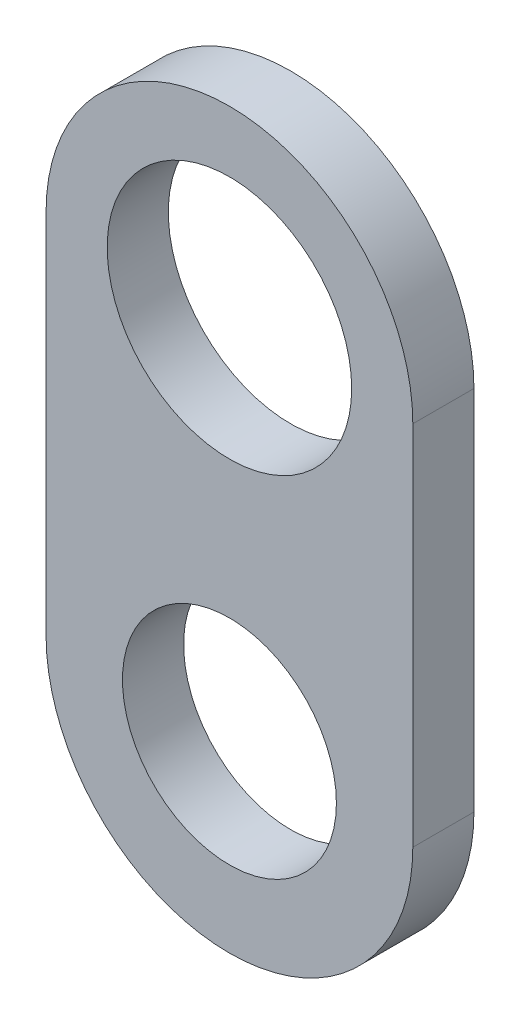
ISO-10303-21;
HEADER;
FILE_DESCRIPTION(('STEP AP214'),'2;1');
FILE_NAME('part.step','',(''),(''),'','','');
FILE_SCHEMA(('AUTOMOTIVE_DESIGN { 1 0 10303 214 1 1 1 1 }'));
ENDSEC;
DATA;
#1=APPLICATION_CONTEXT('core data for automotive mechanical design processes');
#2=APPLICATION_PROTOCOL_DEFINITION('international standard','automotive_design',2000,#1);
#3=PRODUCT_CONTEXT('',#1,'mechanical');
#4=PRODUCT('Part','Part','',(#3));
#5=PRODUCT_RELATED_PRODUCT_CATEGORY('part','',(#4));
#6=PRODUCT_DEFINITION_FORMATION('','',#4);
#7=PRODUCT_DEFINITION_CONTEXT('part definition',#1,'design');
#8=PRODUCT_DEFINITION('design','',#6,#7);
#9=PRODUCT_DEFINITION_SHAPE('','',#8);
#10=(LENGTH_UNIT() NAMED_UNIT(*) SI_UNIT(.MILLI.,.METRE.));
#11=(NAMED_UNIT(*) PLANE_ANGLE_UNIT() SI_UNIT($,.RADIAN.));
#12=(NAMED_UNIT(*) SI_UNIT($,.STERADIAN.) SOLID_ANGLE_UNIT());
#13=UNCERTAINTY_MEASURE_WITH_UNIT(LENGTH_MEASURE(1.E-05),#10,'distance_accuracy_value','');
#14=(GEOMETRIC_REPRESENTATION_CONTEXT(3) GLOBAL_UNCERTAINTY_ASSIGNED_CONTEXT((#13)) GLOBAL_UNIT_ASSIGNED_CONTEXT((#10,
#11,#12)) REPRESENTATION_CONTEXT('',''));
#15=CARTESIAN_POINT('',(0.,0.,0.));
#16=DIRECTION('',(0.,0.,1.));
#17=DIRECTION('',(1.,0.,0.));
#18=AXIS2_PLACEMENT_3D('',#15,#16,#17);
#19=CARTESIAN_POINT('',(0.,0.,250.));
#20=DIRECTION('',(0.,0.,-1.));
#21=DIRECTION('',(-1.,0.,0.));
#22=AXIS2_PLACEMENT_3D('',#19,#20,#21);
#23=CYLINDRICAL_SURFACE('',#22,750.);
#24=CARTESIAN_POINT('',(0.,0.,0.));
#25=DIRECTION('',(0.,0.,1.));
#26=DIRECTION('',(1.,0.,0.));
#27=AXIS2_PLACEMENT_3D('',#24,#25,#26);
#28=CIRCLE('',#27,750.);
#29=CARTESIAN_POINT('',(750.,0.,0.));
#30=VERTEX_POINT('',#29);
#31=CARTESIAN_POINT('',(-750.,0.,0.));
#32=VERTEX_POINT('',#31);
#33=EDGE_CURVE('E111',#30,#32,#28,.T.);
#34=ORIENTED_EDGE('',*,*,#33,.T.);
#35=DIRECTION('',(0.,0.,-1.));
#36=VECTOR('',#35,1.);
#37=CARTESIAN_POINT('',(-750.,0.,250.));
#38=LINE('',#37,#36);
#39=CARTESIAN_POINT('',(-750.,0.,250.));
#40=VERTEX_POINT('',#39);
#41=EDGE_CURVE('E11',#40,#32,#38,.T.);
#42=ORIENTED_EDGE('',*,*,#41,.F.);
#43=CARTESIAN_POINT('',(0.,0.,250.));
#44=DIRECTION('',(0.,0.,1.));
#45=DIRECTION('',(1.,0.,0.));
#46=AXIS2_PLACEMENT_3D('',#43,#44,#45);
#47=CIRCLE('',#46,750.);
#48=CARTESIAN_POINT('',(750.,0.,250.));
#49=VERTEX_POINT('',#48);
#50=EDGE_CURVE('E100',#49,#40,#47,.T.);
#51=ORIENTED_EDGE('',*,*,#50,.F.);
#52=DIRECTION('',(0.,0.,-1.));
#53=VECTOR('',#52,1.);
#54=CARTESIAN_POINT('',(750.,0.,250.));
#55=LINE('',#54,#53);
#56=EDGE_CURVE('E109',#49,#30,#55,.T.);
#57=ORIENTED_EDGE('',*,*,#56,.T.);
#58=EDGE_LOOP('',(#34,#42,#51,#57));
#59=FACE_BOUND('',#58,.T.);
#60=ADVANCED_FACE('F44',(#59),#23,.T.);
#61=CARTESIAN_POINT('',(-750.,0.,250.));
#62=DIRECTION('',(1.,0.,0.));
#63=DIRECTION('',(0.,1.,0.));
#64=AXIS2_PLACEMENT_3D('',#61,#62,#63);
#65=PLANE('',#64);
#66=DIRECTION('',(0.,-1.,0.));
#67=VECTOR('',#66,1.);
#68=CARTESIAN_POINT('',(-750.,0.,0.));
#69=LINE('',#68,#67);
#70=CARTESIAN_POINT('',(-750.,-1500.,0.));
#71=VERTEX_POINT('',#70);
#72=EDGE_CURVE('E105',#32,#71,#69,.T.);
#73=ORIENTED_EDGE('',*,*,#72,.T.);
#74=DIRECTION('',(0.,0.,-1.));
#75=VECTOR('',#74,1.);
#76=CARTESIAN_POINT('',(-750.,-1500.,250.));
#77=LINE('',#76,#75);
#78=CARTESIAN_POINT('',(-750.,-1500.,250.));
#79=VERTEX_POINT('',#78);
#80=EDGE_CURVE('E53',#79,#71,#77,.T.);
#81=ORIENTED_EDGE('',*,*,#80,.F.);
#82=DIRECTION('',(0.,-1.,0.));
#83=VECTOR('',#82,1.);
#84=CARTESIAN_POINT('',(-750.,0.,250.));
#85=LINE('',#84,#83);
#86=EDGE_CURVE('E95',#40,#79,#85,.T.);
#87=ORIENTED_EDGE('',*,*,#86,.F.);
#88=ORIENTED_EDGE('',*,*,#41,.T.);
#89=EDGE_LOOP('',(#73,#81,#87,#88));
#90=FACE_BOUND('',#89,.T.);
#91=ADVANCED_FACE('F102',(#90),#65,.F.);
#92=CARTESIAN_POINT('',(0.,-1500.,250.));
#93=DIRECTION('',(0.,0.,-1.));
#94=DIRECTION('',(-1.,0.,0.));
#95=AXIS2_PLACEMENT_3D('',#92,#93,#94);
#96=CYLINDRICAL_SURFACE('',#95,750.);
#97=CARTESIAN_POINT('',(0.,-1500.,0.));
#98=DIRECTION('',(0.,0.,1.));
#99=DIRECTION('',(1.,0.,0.));
#100=AXIS2_PLACEMENT_3D('',#97,#98,#99);
#101=CIRCLE('',#100,750.);
#102=CARTESIAN_POINT('',(750.,-1500.,0.));
#103=VERTEX_POINT('',#102);
#104=EDGE_CURVE('E80',#71,#103,#101,.T.);
#105=ORIENTED_EDGE('',*,*,#104,.T.);
#106=DIRECTION('',(0.,0.,-1.));
#107=VECTOR('',#106,1.);
#108=CARTESIAN_POINT('',(750.,-1500.,250.));
#109=LINE('',#108,#107);
#110=CARTESIAN_POINT('',(750.,-1500.,250.));
#111=VERTEX_POINT('',#110);
#112=EDGE_CURVE('E101',#111,#103,#109,.T.);
#113=ORIENTED_EDGE('',*,*,#112,.F.);
#114=CARTESIAN_POINT('',(0.,-1500.,250.));
#115=DIRECTION('',(0.,0.,1.));
#116=DIRECTION('',(1.,0.,0.));
#117=AXIS2_PLACEMENT_3D('',#114,#115,#116);
#118=CIRCLE('',#117,750.);
#119=EDGE_CURVE('E94',#79,#111,#118,.T.);
#120=ORIENTED_EDGE('',*,*,#119,.F.);
#121=ORIENTED_EDGE('',*,*,#80,.T.);
#122=EDGE_LOOP('',(#105,#113,#120,#121));
#123=FACE_BOUND('',#122,.T.);
#124=ADVANCED_FACE('F103',(#123),#96,.T.);
#125=CARTESIAN_POINT('',(750.,0.,250.));
#126=DIRECTION('',(-1.,0.,0.));
#127=DIRECTION('',(0.,0.,1.));
#128=AXIS2_PLACEMENT_3D('',#125,#126,#127);
#129=PLANE('',#128);
#130=DIRECTION('',(0.,1.,0.));
#131=VECTOR('',#130,1.);
#132=CARTESIAN_POINT('',(750.,0.,0.));
#133=LINE('',#132,#131);
#134=EDGE_CURVE('E82',#103,#30,#133,.T.);
#135=ORIENTED_EDGE('',*,*,#134,.T.);
#136=ORIENTED_EDGE('',*,*,#56,.F.);
#137=DIRECTION('',(0.,1.,0.));
#138=VECTOR('',#137,1.);
#139=CARTESIAN_POINT('',(750.,0.,250.));
#140=LINE('',#139,#138);
#141=EDGE_CURVE('E65',#111,#49,#140,.T.);
#142=ORIENTED_EDGE('',*,*,#141,.F.);
#143=ORIENTED_EDGE('',*,*,#112,.T.);
#144=EDGE_LOOP('',(#135,#136,#142,#143));
#145=FACE_BOUND('',#144,.T.);
#146=ADVANCED_FACE('F130',(#145),#129,.F.);
#147=CARTESIAN_POINT('',(0.,0.,250.));
#148=DIRECTION('',(0.,0.,1.));
#149=DIRECTION('',(1.,0.,0.));
#150=AXIS2_PLACEMENT_3D('',#147,#148,#149);
#151=PLANE('',#150);
#152=CARTESIAN_POINT('',(0.,0.,250.));
#153=DIRECTION('',(0.,0.,1.));
#154=DIRECTION('',(1.,0.,0.));
#155=AXIS2_PLACEMENT_3D('',#152,#153,#154);
#156=CIRCLE('',#155,500.);
#157=CARTESIAN_POINT('',(500.,0.,250.));
#158=VERTEX_POINT('',#157);
#159=EDGE_CURVE('E145',#158,#158,#156,.T.);
#160=ORIENTED_EDGE('',*,*,#159,.F.);
#161=EDGE_LOOP('',(#160));
#162=FACE_BOUND('',#161,.T.);
#163=CARTESIAN_POINT('',(0.,-1500.,250.));
#164=DIRECTION('',(0.,0.,1.));
#165=DIRECTION('',(1.,0.,0.));
#166=AXIS2_PLACEMENT_3D('',#163,#164,#165);
#167=CIRCLE('',#166,437.5);
#168=CARTESIAN_POINT('',(437.5,-1500.,250.));
#169=VERTEX_POINT('',#168);
#170=EDGE_CURVE('E138',#169,#169,#167,.T.);
#171=ORIENTED_EDGE('',*,*,#170,.F.);
#172=EDGE_LOOP('',(#171));
#173=FACE_BOUND('',#172,.T.);
#174=ORIENTED_EDGE('',*,*,#50,.T.);
#175=ORIENTED_EDGE('',*,*,#86,.T.);
#176=ORIENTED_EDGE('',*,*,#119,.T.);
#177=ORIENTED_EDGE('',*,*,#141,.T.);
#178=EDGE_LOOP('',(#174,#175,#176,#177));
#179=FACE_BOUND('',#178,.T.);
#180=ADVANCED_FACE('F93',(#162,#173,#179),#151,.T.);
#181=CARTESIAN_POINT('',(0.,0.,0.));
#182=DIRECTION('',(0.,0.,1.));
#183=DIRECTION('',(1.,0.,0.));
#184=AXIS2_PLACEMENT_3D('',#181,#182,#183);
#185=PLANE('',#184);
#186=CARTESIAN_POINT('',(0.,0.,0.));
#187=DIRECTION('',(0.,0.,1.));
#188=DIRECTION('',(1.,0.,0.));
#189=AXIS2_PLACEMENT_3D('',#186,#187,#188);
#190=CIRCLE('',#189,500.);
#191=CARTESIAN_POINT('',(500.,0.,0.));
#192=VERTEX_POINT('',#191);
#193=EDGE_CURVE('E120',#192,#192,#190,.T.);
#194=ORIENTED_EDGE('',*,*,#193,.T.);
#195=EDGE_LOOP('',(#194));
#196=FACE_BOUND('',#195,.T.);
#197=CARTESIAN_POINT('',(0.,-1500.,0.));
#198=DIRECTION('',(0.,0.,1.));
#199=DIRECTION('',(1.,0.,0.));
#200=AXIS2_PLACEMENT_3D('',#197,#198,#199);
#201=CIRCLE('',#200,437.5);
#202=CARTESIAN_POINT('',(437.5,-1500.,0.));
#203=VERTEX_POINT('',#202);
#204=EDGE_CURVE('E132',#203,#203,#201,.T.);
#205=ORIENTED_EDGE('',*,*,#204,.T.);
#206=EDGE_LOOP('',(#205));
#207=FACE_BOUND('',#206,.T.);
#208=ORIENTED_EDGE('',*,*,#33,.F.);
#209=ORIENTED_EDGE('',*,*,#134,.F.);
#210=ORIENTED_EDGE('',*,*,#104,.F.);
#211=ORIENTED_EDGE('',*,*,#72,.F.);
#212=EDGE_LOOP('',(#208,#209,#210,#211));
#213=FACE_BOUND('',#212,.T.);
#214=ADVANCED_FACE('F127',(#196,#207,#213),#185,.F.);
#215=CARTESIAN_POINT('',(0.,-1500.,0.));
#216=DIRECTION('',(0.,0.,1.));
#217=DIRECTION('',(1.,0.,0.));
#218=AXIS2_PLACEMENT_3D('',#215,#216,#217);
#219=CYLINDRICAL_SURFACE('',#218,437.5);
#220=ORIENTED_EDGE('',*,*,#204,.F.);
#221=EDGE_LOOP('',(#220));
#222=FACE_BOUND('',#221,.T.);
#223=ORIENTED_EDGE('',*,*,#170,.T.);
#224=EDGE_LOOP('',(#223));
#225=FACE_BOUND('',#224,.T.);
#226=ADVANCED_FACE('F151',(#222,#225),#219,.F.);
#227=CARTESIAN_POINT('',(0.,0.,0.));
#228=DIRECTION('',(0.,0.,1.));
#229=DIRECTION('',(1.,0.,0.));
#230=AXIS2_PLACEMENT_3D('',#227,#228,#229);
#231=CYLINDRICAL_SURFACE('',#230,500.);
#232=ORIENTED_EDGE('',*,*,#193,.F.);
#233=EDGE_LOOP('',(#232));
#234=FACE_BOUND('',#233,.T.);
#235=ORIENTED_EDGE('',*,*,#159,.T.);
#236=EDGE_LOOP('',(#235));
#237=FACE_BOUND('',#236,.T.);
#238=ADVANCED_FACE('F155',(#234,#237),#231,.F.);
#239=CLOSED_SHELL('',(#60,#91,#124,#146,#180,#214,#226,#238));
#240=MANIFOLD_SOLID_BREP('B2',#239);
#241=ADVANCED_BREP_SHAPE_REPRESENTATION('',(#18,#240),#14);
#242=SHAPE_DEFINITION_REPRESENTATION(#9,#241);
ENDSEC;
END-ISO-10303-21;
